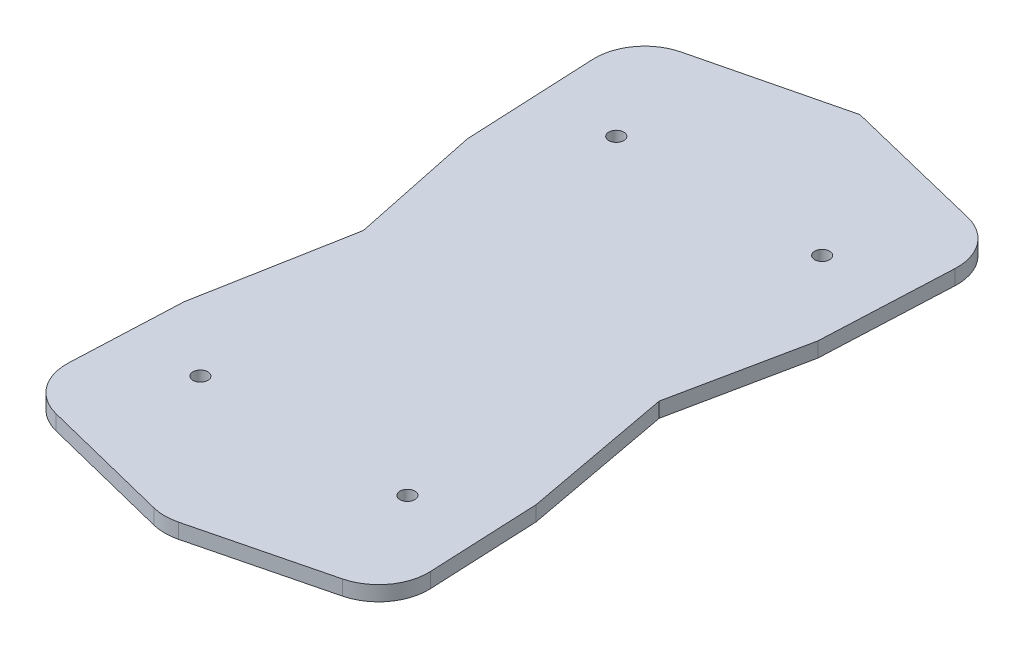
ISO-10303-21;
HEADER;
FILE_DESCRIPTION(('STEP AP214'),'2;1');
FILE_NAME('part.step','',(''),(''),'','','');
FILE_SCHEMA(('AUTOMOTIVE_DESIGN { 1 0 10303 214 1 1 1 1 }'));
ENDSEC;
DATA;
#1=APPLICATION_CONTEXT('core data for automotive mechanical design processes');
#2=APPLICATION_PROTOCOL_DEFINITION('international standard','automotive_design',2000,#1);
#3=PRODUCT_CONTEXT('',#1,'mechanical');
#4=PRODUCT('Part','Part','',(#3));
#5=PRODUCT_RELATED_PRODUCT_CATEGORY('part','',(#4));
#6=PRODUCT_DEFINITION_FORMATION('','',#4);
#7=PRODUCT_DEFINITION_CONTEXT('part definition',#1,'design');
#8=PRODUCT_DEFINITION('design','',#6,#7);
#9=PRODUCT_DEFINITION_SHAPE('','',#8);
#10=(LENGTH_UNIT() NAMED_UNIT(*) SI_UNIT(.MILLI.,.METRE.));
#11=(NAMED_UNIT(*) PLANE_ANGLE_UNIT() SI_UNIT($,.RADIAN.));
#12=(NAMED_UNIT(*) SI_UNIT($,.STERADIAN.) SOLID_ANGLE_UNIT());
#13=UNCERTAINTY_MEASURE_WITH_UNIT(LENGTH_MEASURE(1.E-05),#10,'distance_accuracy_value','');
#14=(GEOMETRIC_REPRESENTATION_CONTEXT(3) GLOBAL_UNCERTAINTY_ASSIGNED_CONTEXT((#13)) GLOBAL_UNIT_ASSIGNED_CONTEXT((#10,
#11,#12)) REPRESENTATION_CONTEXT('',''));
#15=CARTESIAN_POINT('',(0.,0.,0.));
#16=DIRECTION('',(0.,0.,1.));
#17=DIRECTION('',(1.,0.,0.));
#18=AXIS2_PLACEMENT_3D('',#15,#16,#17);
#19=CARTESIAN_POINT('',(-10.3710193297177,3.,41.4840773188708));
#20=DIRECTION('',(-0.242535625036333,0.,0.970142500145332));
#21=DIRECTION('',(0.970142500145332,0.,0.242535625036333));
#22=AXIS2_PLACEMENT_3D('',#19,#20,#21);
#23=PLANE('',#22);
#24=DIRECTION('',(-0.970142500145332,0.,-0.242535625036333));
#25=VECTOR('',#24,1.);
#26=CARTESIAN_POINT('',(-10.3710193297177,0.,41.4840773188708));
#27=LINE('',#26,#25);
#28=CARTESIAN_POINT('',(-2.42535625036336,0.,43.4704930887094));
#29=VERTEX_POINT('',#28);
#30=CARTESIAN_POINT('',(-28.730703821593,0.,36.894156195902));
#31=VERTEX_POINT('',#30);
#32=EDGE_CURVE('E199',#29,#31,#27,.T.);
#33=ORIENTED_EDGE('',*,*,#32,.F.);
#34=DIRECTION('',(0.,-1.,0.));
#35=VECTOR('',#34,1.);
#36=CARTESIAN_POINT('',(-2.42535625036336,3.,43.4704930887094));
#37=LINE('',#36,#35);
#38=CARTESIAN_POINT('',(-2.42535625036336,3.,43.4704930887094));
#39=VERTEX_POINT('',#38);
#40=EDGE_CURVE('E11',#39,#29,#37,.T.);
#41=ORIENTED_EDGE('',*,*,#40,.F.);
#42=DIRECTION('',(-0.970142500145332,0.,-0.242535625036333));
#43=VECTOR('',#42,1.);
#44=CARTESIAN_POINT('',(-10.3710193297177,3.,41.4840773188708));
#45=LINE('',#44,#43);
#46=CARTESIAN_POINT('',(-28.730703821593,3.,36.894156195902));
#47=VERTEX_POINT('',#46);
#48=EDGE_CURVE('E564',#39,#47,#45,.T.);
#49=ORIENTED_EDGE('',*,*,#48,.T.);
#50=DIRECTION('',(0.,-1.,0.));
#51=VECTOR('',#50,1.);
#52=CARTESIAN_POINT('',(-28.730703821593,3.,36.894156195902));
#53=LINE('',#52,#51);
#54=EDGE_CURVE('E56',#47,#31,#53,.T.);
#55=ORIENTED_EDGE('',*,*,#54,.T.);
#56=EDGE_LOOP('',(#33,#41,#49,#55));
#57=FACE_BOUND('',#56,.T.);
#58=ADVANCED_FACE('F39',(#57),#23,.T.);
#59=CARTESIAN_POINT('',(0.,3.,33.7690680872561));
#60=DIRECTION('',(0.,-1.,0.));
#61=DIRECTION('',(0.,0.,-1.));
#62=AXIS2_PLACEMENT_3D('',#59,#60,#61);
#63=CYLINDRICAL_SURFACE('',#62,10.);
#64=CARTESIAN_POINT('',(0.,0.,33.7690680872561));
#65=DIRECTION('',(0.,1.,0.));
#66=DIRECTION('',(0.,0.,1.));
#67=AXIS2_PLACEMENT_3D('',#64,#65,#66);
#68=CIRCLE('',#67,10.);
#69=CARTESIAN_POINT('',(2.42535625036337,0.,43.4704930887094));
#70=VERTEX_POINT('',#69);
#71=EDGE_CURVE('E201',#29,#70,#68,.T.);
#72=ORIENTED_EDGE('',*,*,#71,.T.);
#73=DIRECTION('',(0.,-1.,0.));
#74=VECTOR('',#73,1.);
#75=CARTESIAN_POINT('',(2.42535625036337,3.,43.4704930887094));
#76=LINE('',#75,#74);
#77=CARTESIAN_POINT('',(2.42535625036337,3.,43.4704930887094));
#78=VERTEX_POINT('',#77);
#79=EDGE_CURVE('E48',#78,#70,#76,.T.);
#80=ORIENTED_EDGE('',*,*,#79,.F.);
#81=CARTESIAN_POINT('',(0.,3.,33.7690680872561));
#82=DIRECTION('',(0.,1.,0.));
#83=DIRECTION('',(0.,0.,1.));
#84=AXIS2_PLACEMENT_3D('',#81,#82,#83);
#85=CIRCLE('',#84,10.);
#86=EDGE_CURVE('E525',#39,#78,#85,.T.);
#87=ORIENTED_EDGE('',*,*,#86,.F.);
#88=ORIENTED_EDGE('',*,*,#40,.T.);
#89=EDGE_LOOP('',(#72,#80,#87,#88));
#90=FACE_BOUND('',#89,.T.);
#91=ADVANCED_FACE('F287',(#90),#63,.T.);
#92=CARTESIAN_POINT('',(10.3710193297177,3.,41.4840773188708));
#93=DIRECTION('',(-0.242535625036333,0.,-0.970142500145332));
#94=DIRECTION('',(-0.970142500145332,0.,0.242535625036333));
#95=AXIS2_PLACEMENT_3D('',#92,#93,#94);
#96=PLANE('',#95);
#97=DIRECTION('',(0.970142500145332,0.,-0.242535625036333));
#98=VECTOR('',#97,1.);
#99=CARTESIAN_POINT('',(10.3710193297177,0.,41.4840773188708));
#100=LINE('',#99,#98);
#101=CARTESIAN_POINT('',(28.8037959309387,0.,36.8758831685656));
#102=VERTEX_POINT('',#101);
#103=EDGE_CURVE('E204',#70,#102,#100,.T.);
#104=ORIENTED_EDGE('',*,*,#103,.T.);
#105=DIRECTION('',(0.,-1.,0.));
#106=VECTOR('',#105,1.);
#107=CARTESIAN_POINT('',(28.8037959309387,3.,36.8758831685656));
#108=LINE('',#107,#106);
#109=CARTESIAN_POINT('',(28.8037959309387,3.,36.8758831685656));
#110=VERTEX_POINT('',#109);
#111=EDGE_CURVE('E275',#110,#102,#108,.T.);
#112=ORIENTED_EDGE('',*,*,#111,.F.);
#113=DIRECTION('',(0.970142500145332,0.,-0.242535625036333));
#114=VECTOR('',#113,1.);
#115=CARTESIAN_POINT('',(10.3710193297177,3.,41.4840773188708));
#116=LINE('',#115,#114);
#117=EDGE_CURVE('E283',#78,#110,#116,.T.);
#118=ORIENTED_EDGE('',*,*,#117,.F.);
#119=ORIENTED_EDGE('',*,*,#79,.T.);
#120=EDGE_LOOP('',(#104,#112,#118,#119));
#121=FACE_BOUND('',#120,.T.);
#122=ADVANCED_FACE('F280',(#121),#96,.F.);
#123=CARTESIAN_POINT('',(26.3784396805755,3.,27.1744581671122));
#124=DIRECTION('',(0.,-1.,0.));
#125=DIRECTION('',(0.,0.,-1.));
#126=AXIS2_PLACEMENT_3D('',#123,#124,#125);
#127=CYLINDRICAL_SURFACE('',#126,10.);
#128=CARTESIAN_POINT('',(26.3784396805755,0.,27.1744581671122));
#129=DIRECTION('',(0.,1.,0.));
#130=DIRECTION('',(0.,0.,1.));
#131=AXIS2_PLACEMENT_3D('',#128,#129,#130);
#132=CIRCLE('',#131,10.);
#133=CARTESIAN_POINT('',(36.3680270661534,0.,26.7182303009069));
#134=VERTEX_POINT('',#133);
#135=EDGE_CURVE('E207',#102,#134,#132,.T.);
#136=ORIENTED_EDGE('',*,*,#135,.T.);
#137=DIRECTION('',(0.,-1.,0.));
#138=VECTOR('',#137,1.);
#139=CARTESIAN_POINT('',(36.3680270661534,3.,26.7182303009069));
#140=LINE('',#139,#138);
#141=CARTESIAN_POINT('',(36.3680270661534,3.,26.7182303009069));
#142=VERTEX_POINT('',#141);
#143=EDGE_CURVE('E272',#142,#134,#140,.T.);
#144=ORIENTED_EDGE('',*,*,#143,.F.);
#145=CARTESIAN_POINT('',(26.3784396805755,3.,27.1744581671122));
#146=DIRECTION('',(0.,1.,0.));
#147=DIRECTION('',(0.,0.,1.));
#148=AXIS2_PLACEMENT_3D('',#145,#146,#147);
#149=CIRCLE('',#148,10.);
#150=EDGE_CURVE('E522',#110,#142,#149,.T.);
#151=ORIENTED_EDGE('',*,*,#150,.F.);
#152=ORIENTED_EDGE('',*,*,#111,.T.);
#153=EDGE_LOOP('',(#136,#144,#151,#152));
#154=FACE_BOUND('',#153,.T.);
#155=ADVANCED_FACE('F379',(#154),#127,.T.);
#156=CARTESIAN_POINT('',(35.0746383849418,3.,-1.60187070903288));
#157=DIRECTION('',(-0.998958738557794,0.,0.0456227866205218));
#158=DIRECTION('',(0.0456227866205218,0.,0.998958738557794));
#159=AXIS2_PLACEMENT_3D('',#156,#157,#158);
#160=PLANE('',#159);
#161=DIRECTION('',(-0.0456227866205218,0.,-0.998958738557794));
#162=VECTOR('',#161,1.);
#163=CARTESIAN_POINT('',(35.0746383849418,0.,-1.60187070903288));
#164=LINE('',#163,#162);
#165=CARTESIAN_POINT('',(35.3529653568447,0.,4.49239010566538));
#166=VERTEX_POINT('',#165);
#167=EDGE_CURVE('E210',#134,#166,#164,.T.);
#168=ORIENTED_EDGE('',*,*,#167,.T.);
#169=DIRECTION('',(0.,-1.,0.));
#170=VECTOR('',#169,1.);
#171=CARTESIAN_POINT('',(35.3529653568447,3.,4.49239010566538));
#172=LINE('',#171,#170);
#173=CARTESIAN_POINT('',(35.3529653568447,3.,4.49239010566538));
#174=VERTEX_POINT('',#173);
#175=EDGE_CURVE('E269',#174,#166,#172,.T.);
#176=ORIENTED_EDGE('',*,*,#175,.F.);
#177=DIRECTION('',(-0.0456227866205218,0.,-0.998958738557794));
#178=VECTOR('',#177,1.);
#179=CARTESIAN_POINT('',(35.0746383849418,3.,-1.60187070903288));
#180=LINE('',#179,#178);
#181=EDGE_CURVE('E519',#142,#174,#180,.T.);
#182=ORIENTED_EDGE('',*,*,#181,.F.);
#183=ORIENTED_EDGE('',*,*,#143,.T.);
#184=EDGE_LOOP('',(#168,#176,#182,#183));
#185=FACE_BOUND('',#184,.T.);
#186=ADVANCED_FACE('F375',(#185),#160,.F.);
#187=CARTESIAN_POINT('',(33.3628804391479,3.,-6.20604473246921));
#188=DIRECTION('',(-0.983135362850529,0.,0.182879354528495));
#189=DIRECTION('',(0.182879354528495,0.,0.983135362850529));
#190=AXIS2_PLACEMENT_3D('',#187,#188,#189);
#191=PLANE('',#190);
#192=DIRECTION('',(-0.182879354528495,0.,-0.983135362850529));
#193=VECTOR('',#192,1.);
#194=CARTESIAN_POINT('',(33.3628804391479,0.,-6.20604473246921));
#195=LINE('',#194,#193);
#196=CARTESIAN_POINT('',(29.6982295397226,0.,-25.9067260970551));
#197=VERTEX_POINT('',#196);
#198=EDGE_CURVE('E213',#166,#197,#195,.T.);
#199=ORIENTED_EDGE('',*,*,#198,.T.);
#200=DIRECTION('',(0.,-1.,0.));
#201=VECTOR('',#200,1.);
#202=CARTESIAN_POINT('',(29.6982295397226,3.,-25.9067260970551));
#203=LINE('',#202,#201);
#204=CARTESIAN_POINT('',(29.6982295397226,3.,-25.9067260970551));
#205=VERTEX_POINT('',#204);
#206=EDGE_CURVE('E267',#205,#197,#203,.T.);
#207=ORIENTED_EDGE('',*,*,#206,.F.);
#208=DIRECTION('',(-0.182879354528495,0.,-0.983135362850529));
#209=VECTOR('',#208,1.);
#210=CARTESIAN_POINT('',(33.3628804391479,3.,-6.20604473246921));
#211=LINE('',#210,#209);
#212=EDGE_CURVE('E521',#174,#205,#211,.T.);
#213=ORIENTED_EDGE('',*,*,#212,.F.);
#214=ORIENTED_EDGE('',*,*,#175,.T.);
#215=EDGE_LOOP('',(#199,#207,#213,#214));
#216=FACE_BOUND('',#215,.T.);
#217=ADVANCED_FACE('F371',(#216),#191,.F.);
#218=CARTESIAN_POINT('',(23.3411092015436,3.,4.82785890857507));
#219=DIRECTION('',(0.97927153969698,0.,0.202551849015274));
#220=DIRECTION('',(0.202551849015274,0.,-0.97927153969698));
#221=AXIS2_PLACEMENT_3D('',#218,#219,#220);
#222=PLANE('',#221);
#223=DIRECTION('',(-0.202551849015274,0.,0.97927153969698));
#224=VECTOR('',#223,1.);
#225=CARTESIAN_POINT('',(23.3411092015436,0.,4.82785890857507));
#226=LINE('',#225,#224);
#227=CARTESIAN_POINT('',(35.1590447336644,0.,-52.3079706621877));
#228=VERTEX_POINT('',#227);
#229=EDGE_CURVE('E216',#228,#197,#226,.T.);
#230=ORIENTED_EDGE('',*,*,#229,.F.);
#231=DIRECTION('',(0.,-1.,0.));
#232=VECTOR('',#231,1.);
#233=CARTESIAN_POINT('',(35.1590447336644,3.,-52.3079706621877));
#234=LINE('',#233,#232);
#235=CARTESIAN_POINT('',(35.1590447336644,3.,-52.3079706621877));
#236=VERTEX_POINT('',#235);
#237=EDGE_CURVE('E265',#236,#228,#234,.T.);
#238=ORIENTED_EDGE('',*,*,#237,.F.);
#239=DIRECTION('',(-0.202551849015274,0.,0.97927153969698));
#240=VECTOR('',#239,1.);
#241=CARTESIAN_POINT('',(23.3411092015436,3.,4.82785890857507));
#242=LINE('',#241,#240);
#243=EDGE_CURVE('E530',#236,#205,#242,.T.);
#244=ORIENTED_EDGE('',*,*,#243,.T.);
#245=ORIENTED_EDGE('',*,*,#206,.T.);
#246=EDGE_LOOP('',(#230,#238,#244,#245));
#247=FACE_BOUND('',#246,.T.);
#248=ADVANCED_FACE('F367',(#247),#222,.T.);
#249=CARTESIAN_POINT('',(32.7256015210382,3.,1.48053730997149));
#250=DIRECTION('',(0.998978196470814,0.,0.0451947228768965));
#251=DIRECTION('',(0.0451947228768965,0.,-0.998978196470814));
#252=AXIS2_PLACEMENT_3D('',#249,#250,#251);
#253=PLANE('',#252);
#254=DIRECTION('',(-0.0451947228768966,0.,0.998978196470814));
#255=VECTOR('',#254,1.);
#256=CARTESIAN_POINT('',(32.7256015210382,0.,1.48053730997149));
#257=LINE('',#256,#255);
#258=CARTESIAN_POINT('',(36.3534621252968,0.,-78.7092152273204));
#259=VERTEX_POINT('',#258);
#260=EDGE_CURVE('E219',#259,#228,#257,.T.);
#261=ORIENTED_EDGE('',*,*,#260,.F.);
#262=DIRECTION('',(0.,-1.,0.));
#263=VECTOR('',#262,1.);
#264=CARTESIAN_POINT('',(36.3534621252968,3.,-78.7092152273204));
#265=LINE('',#264,#263);
#266=CARTESIAN_POINT('',(36.3534621252968,3.,-78.7092152273204));
#267=VERTEX_POINT('',#266);
#268=EDGE_CURVE('E263',#267,#259,#265,.T.);
#269=ORIENTED_EDGE('',*,*,#268,.F.);
#270=DIRECTION('',(-0.0451947228768966,0.,0.998978196470814));
#271=VECTOR('',#270,1.);
#272=CARTESIAN_POINT('',(32.7256015210382,3.,1.48053730997149));
#273=LINE('',#272,#271);
#274=EDGE_CURVE('E533',#267,#236,#273,.T.);
#275=ORIENTED_EDGE('',*,*,#274,.T.);
#276=ORIENTED_EDGE('',*,*,#237,.T.);
#277=EDGE_LOOP('',(#261,#269,#275,#276));
#278=FACE_BOUND('',#277,.T.);
#279=ADVANCED_FACE('F363',(#278),#253,.T.);
#280=CARTESIAN_POINT('',(26.3636801605887,3.,-79.1611624560894));
#281=DIRECTION('',(0.,-1.,0.));
#282=DIRECTION('',(0.,0.,-1.));
#283=AXIS2_PLACEMENT_3D('',#280,#281,#282);
#284=CYLINDRICAL_SURFACE('',#283,10.);
#285=CARTESIAN_POINT('',(26.3636801605887,0.,-79.1611624560894));
#286=DIRECTION('',(0.,1.,0.));
#287=DIRECTION('',(0.,0.,1.));
#288=AXIS2_PLACEMENT_3D('',#285,#286,#287);
#289=CIRCLE('',#288,10.);
#290=CARTESIAN_POINT('',(28.7455821439129,0.,-88.8733477375714));
#291=VERTEX_POINT('',#290);
#292=EDGE_CURVE('E222',#291,#259,#289,.F.);
#293=ORIENTED_EDGE('',*,*,#292,.F.);
#294=DIRECTION('',(0.,-1.,0.));
#295=VECTOR('',#294,1.);
#296=CARTESIAN_POINT('',(28.7455821439129,3.,-88.8733477375714));
#297=LINE('',#296,#295);
#298=CARTESIAN_POINT('',(28.7455821439129,3.,-88.8733477375714));
#299=VERTEX_POINT('',#298);
#300=EDGE_CURVE('E261',#299,#291,#297,.T.);
#301=ORIENTED_EDGE('',*,*,#300,.F.);
#302=CARTESIAN_POINT('',(26.3636801605887,3.,-79.1611624560894));
#303=DIRECTION('',(0.,1.,0.));
#304=DIRECTION('',(0.,0.,1.));
#305=AXIS2_PLACEMENT_3D('',#302,#303,#304);
#306=CIRCLE('',#305,10.);
#307=EDGE_CURVE('E536',#299,#267,#306,.F.);
#308=ORIENTED_EDGE('',*,*,#307,.T.);
#309=ORIENTED_EDGE('',*,*,#268,.T.);
#310=EDGE_LOOP('',(#293,#301,#308,#309));
#311=FACE_BOUND('',#310,.T.);
#312=ADVANCED_FACE('F359',(#311),#284,.T.);
#313=CARTESIAN_POINT('',(22.190360503728,3.,-90.4810081119732));
#314=DIRECTION('',(0.238190198332426,0.,-0.971218528148202));
#315=DIRECTION('',(-0.971218528148202,0.,-0.238190198332426));
#316=AXIS2_PLACEMENT_3D('',#313,#314,#315);
#317=PLANE('',#316);
#318=DIRECTION('',(0.971218528148202,0.,0.238190198332426));
#319=VECTOR('',#318,1.);
#320=CARTESIAN_POINT('',(22.190360503728,0.,-90.4810081119732));
#321=LINE('',#320,#319);
#322=CARTESIAN_POINT('',(0.,0.,-95.9231678486998));
#323=VERTEX_POINT('',#322);
#324=EDGE_CURVE('E225',#323,#291,#321,.T.);
#325=ORIENTED_EDGE('',*,*,#324,.F.);
#326=DIRECTION('',(0.,-1.,0.));
#327=VECTOR('',#326,1.);
#328=CARTESIAN_POINT('',(0.,3.,-95.9231678486998));
#329=LINE('',#328,#327);
#330=CARTESIAN_POINT('',(0.,3.,-95.9231678486998));
#331=VERTEX_POINT('',#330);
#332=EDGE_CURVE('E259',#331,#323,#329,.T.);
#333=ORIENTED_EDGE('',*,*,#332,.F.);
#334=DIRECTION('',(0.971218528148202,0.,0.238190198332426));
#335=VECTOR('',#334,1.);
#336=CARTESIAN_POINT('',(22.190360503728,3.,-90.4810081119732));
#337=LINE('',#336,#335);
#338=EDGE_CURVE('E539',#331,#299,#337,.T.);
#339=ORIENTED_EDGE('',*,*,#338,.T.);
#340=ORIENTED_EDGE('',*,*,#300,.T.);
#341=EDGE_LOOP('',(#325,#333,#339,#340));
#342=FACE_BOUND('',#341,.T.);
#343=ADVANCED_FACE('F355',(#342),#317,.T.);
#344=CARTESIAN_POINT('',(-22.1648936329896,3.,-90.4942892553151));
#345=DIRECTION('',(0.23789937899726,0.,0.971289805090488));
#346=DIRECTION('',(0.971289805090488,0.,-0.23789937899726));
#347=AXIS2_PLACEMENT_3D('',#344,#345,#346);
#348=PLANE('',#347);
#349=DIRECTION('',(-0.971289805090488,0.,0.23789937899726));
#350=VECTOR('',#349,1.);
#351=CARTESIAN_POINT('',(-22.1648936329896,0.,-90.4942892553151));
#352=LINE('',#351,#350);
#353=CARTESIAN_POINT('',(-28.8409892724337,0.,-88.8591037541123));
#354=VERTEX_POINT('',#353);
#355=EDGE_CURVE('E228',#323,#354,#352,.T.);
#356=ORIENTED_EDGE('',*,*,#355,.T.);
#357=DIRECTION('',(0.,-1.,0.));
#358=VECTOR('',#357,1.);
#359=CARTESIAN_POINT('',(-28.8409892724337,3.,-88.8591037541123));
#360=LINE('',#359,#358);
#361=CARTESIAN_POINT('',(-28.8409892724337,3.,-88.8591037541123));
#362=VERTEX_POINT('',#361);
#363=EDGE_CURVE('E256',#362,#354,#360,.T.);
#364=ORIENTED_EDGE('',*,*,#363,.F.);
#365=DIRECTION('',(-0.971289805090488,0.,0.23789937899726));
#366=VECTOR('',#365,1.);
#367=CARTESIAN_POINT('',(-22.1648936329896,3.,-90.4942892553151));
#368=LINE('',#367,#366);
#369=EDGE_CURVE('E542',#331,#362,#368,.T.);
#370=ORIENTED_EDGE('',*,*,#369,.F.);
#371=ORIENTED_EDGE('',*,*,#332,.T.);
#372=EDGE_LOOP('',(#356,#364,#370,#371));
#373=FACE_BOUND('',#372,.T.);
#374=ADVANCED_FACE('F351',(#373),#348,.F.);
#375=CARTESIAN_POINT('',(-26.4619954824612,3.,-79.1462057032074));
#376=DIRECTION('',(0.,-1.,0.));
#377=DIRECTION('',(0.,0.,-1.));
#378=AXIS2_PLACEMENT_3D('',#375,#376,#377);
#379=CYLINDRICAL_SURFACE('',#378,10.);
#380=CARTESIAN_POINT('',(-26.4619954824612,0.,-79.1462057032074));
#381=DIRECTION('',(0.,1.,0.));
#382=DIRECTION('',(0.,0.,1.));
#383=AXIS2_PLACEMENT_3D('',#380,#381,#382);
#384=CIRCLE('',#383,10.);
#385=CARTESIAN_POINT('',(-36.4511766301933,0.,-78.6811680726947));
#386=VERTEX_POINT('',#385);
#387=EDGE_CURVE('E231',#354,#386,#384,.T.);
#388=ORIENTED_EDGE('',*,*,#387,.T.);
#389=DIRECTION('',(0.,-1.,0.));
#390=VECTOR('',#389,1.);
#391=CARTESIAN_POINT('',(-36.4511766301933,3.,-78.6811680726947));
#392=LINE('',#391,#390);
#393=CARTESIAN_POINT('',(-36.4511766301933,3.,-78.6811680726947));
#394=VERTEX_POINT('',#393);
#395=EDGE_CURVE('E253',#394,#386,#392,.T.);
#396=ORIENTED_EDGE('',*,*,#395,.F.);
#397=CARTESIAN_POINT('',(-26.4619954824612,3.,-79.1462057032074));
#398=DIRECTION('',(0.,1.,0.));
#399=DIRECTION('',(0.,0.,1.));
#400=AXIS2_PLACEMENT_3D('',#397,#398,#399);
#401=CIRCLE('',#400,10.);
#402=EDGE_CURVE('E545',#362,#394,#401,.T.);
#403=ORIENTED_EDGE('',*,*,#402,.F.);
#404=ORIENTED_EDGE('',*,*,#363,.T.);
#405=EDGE_LOOP('',(#388,#396,#403,#404));
#406=FACE_BOUND('',#405,.T.);
#407=ADVANCED_FACE('F347',(#406),#379,.T.);
#408=CARTESIAN_POINT('',(-32.7173355057862,3.,1.52312706670152));
#409=DIRECTION('',(0.998918114773214,0.,-0.0465037630512563));
#410=DIRECTION('',(-0.0465037630512563,0.,-0.998918114773214));
#411=AXIS2_PLACEMENT_3D('',#408,#409,#410);
#412=PLANE('',#411);
#413=DIRECTION('',(0.0465037630512563,0.,0.998918114773214));
#414=VECTOR('',#413,1.);
#415=CARTESIAN_POINT('',(-32.7173355057862,0.,1.52312706670152));
#416=LINE('',#415,#414);
#417=CARTESIAN_POINT('',(-35.2217954691318,0.,-52.2736037989882));
#418=VERTEX_POINT('',#417);
#419=EDGE_CURVE('E234',#386,#418,#416,.T.);
#420=ORIENTED_EDGE('',*,*,#419,.T.);
#421=DIRECTION('',(0.,-1.,0.));
#422=VECTOR('',#421,1.);
#423=CARTESIAN_POINT('',(-35.2217954691318,3.,-52.2736037989882));
#424=LINE('',#423,#422);
#425=CARTESIAN_POINT('',(-35.2217954691318,3.,-52.2736037989882));
#426=VERTEX_POINT('',#425);
#427=EDGE_CURVE('E250',#426,#418,#424,.T.);
#428=ORIENTED_EDGE('',*,*,#427,.F.);
#429=DIRECTION('',(0.0465037630512563,0.,0.998918114773214));
#430=VECTOR('',#429,1.);
#431=CARTESIAN_POINT('',(-32.7173355057862,3.,1.52312706670152));
#432=LINE('',#431,#430);
#433=EDGE_CURVE('E548',#394,#426,#432,.T.);
#434=ORIENTED_EDGE('',*,*,#433,.F.);
#435=ORIENTED_EDGE('',*,*,#395,.T.);
#436=EDGE_LOOP('',(#420,#428,#434,#435));
#437=FACE_BOUND('',#436,.T.);
#438=ADVANCED_FACE('F343',(#437),#412,.F.);
#439=CARTESIAN_POINT('',(-23.3048911482188,3.,4.86085239169404));
#440=DIRECTION('',(0.978932865591026,0.,-0.20418238088959));
#441=DIRECTION('',(-0.20418238088959,0.,-0.978932865591026));
#442=AXIS2_PLACEMENT_3D('',#439,#440,#441);
#443=PLANE('',#442);
#444=DIRECTION('',(0.20418238088959,0.,0.978932865591026));
#445=VECTOR('',#444,1.);
#446=CARTESIAN_POINT('',(-23.3048911482188,0.,4.86085239169404));
#447=LINE('',#446,#445);
#448=CARTESIAN_POINT('',(-29.7137984078166,0.,-25.8660395252816));
#449=VERTEX_POINT('',#448);
#450=EDGE_CURVE('E237',#418,#449,#447,.T.);
#451=ORIENTED_EDGE('',*,*,#450,.T.);
#452=DIRECTION('',(0.,-1.,0.));
#453=VECTOR('',#452,1.);
#454=CARTESIAN_POINT('',(-29.7137984078166,3.,-25.8660395252816));
#455=LINE('',#454,#453);
#456=CARTESIAN_POINT('',(-29.7137984078166,3.,-25.8660395252816));
#457=VERTEX_POINT('',#456);
#458=EDGE_CURVE('E169',#457,#449,#455,.T.);
#459=ORIENTED_EDGE('',*,*,#458,.F.);
#460=DIRECTION('',(0.20418238088959,0.,0.978932865591026));
#461=VECTOR('',#460,1.);
#462=CARTESIAN_POINT('',(-23.3048911482188,3.,4.86085239169404));
#463=LINE('',#462,#461);
#464=EDGE_CURVE('E178',#426,#457,#463,.T.);
#465=ORIENTED_EDGE('',*,*,#464,.F.);
#466=ORIENTED_EDGE('',*,*,#427,.T.);
#467=EDGE_LOOP('',(#451,#459,#465,#466));
#468=FACE_BOUND('',#467,.T.);
#469=ADVANCED_FACE('F340',(#468),#443,.F.);
#470=CARTESIAN_POINT('',(-33.3516445590481,3.,-6.15549452222428));
#471=DIRECTION('',(-0.983391297388068,0.,-0.181498088754159));
#472=DIRECTION('',(-0.181498088754159,0.,0.983391297388068));
#473=AXIS2_PLACEMENT_3D('',#470,#471,#472);
#474=PLANE('',#473);
#475=DIRECTION('',(0.181498088754159,0.,-0.983391297388068));
#476=VECTOR('',#475,1.);
#477=CARTESIAN_POINT('',(-33.3516445590481,0.,-6.15549452222428));
#478=LINE('',#477,#476);
#479=CARTESIAN_POINT('',(-35.3226493526154,0.,4.52378576336424));
#480=VERTEX_POINT('',#479);
#481=EDGE_CURVE('E165',#480,#449,#478,.T.);
#482=ORIENTED_EDGE('',*,*,#481,.F.);
#483=DIRECTION('',(0.,-1.,0.));
#484=VECTOR('',#483,1.);
#485=CARTESIAN_POINT('',(-35.3226493526154,3.,4.52378576336424));
#486=LINE('',#485,#484);
#487=CARTESIAN_POINT('',(-35.3226493526154,3.,4.52378576336424));
#488=VERTEX_POINT('',#487);
#489=EDGE_CURVE('E160',#488,#480,#486,.T.);
#490=ORIENTED_EDGE('',*,*,#489,.F.);
#491=DIRECTION('',(0.181498088754159,0.,-0.983391297388068));
#492=VECTOR('',#491,1.);
#493=CARTESIAN_POINT('',(-33.3516445590481,3.,-6.15549452222428));
#494=LINE('',#493,#492);
#495=EDGE_CURVE('E163',#488,#457,#494,.T.);
#496=ORIENTED_EDGE('',*,*,#495,.T.);
#497=ORIENTED_EDGE('',*,*,#458,.T.);
#498=EDGE_LOOP('',(#482,#490,#496,#497));
#499=FACE_BOUND('',#498,.T.);
#500=ADVANCED_FACE('F162',(#499),#474,.T.);
#501=CARTESIAN_POINT('',(-35.057461625707,3.,-1.53454860580377));
#502=DIRECTION('',(-0.999043363764924,0.,-0.0437305078551037));
#503=DIRECTION('',(-0.0437305078551037,0.,0.999043363764924));
#504=AXIS2_PLACEMENT_3D('',#501,#502,#503);
#505=PLANE('',#504);
#506=DIRECTION('',(0.0437305078551037,0.,-0.999043363764924));
#507=VECTOR('',#506,1.);
#508=CARTESIAN_POINT('',(-35.057461625707,0.,-1.53454860580377));
#509=LINE('',#508,#507);
#510=CARTESIAN_POINT('',(-36.2957812088789,0.,26.7554261158976));
#511=VERTEX_POINT('',#510);
#512=EDGE_CURVE('E241',#511,#480,#509,.T.);
#513=ORIENTED_EDGE('',*,*,#512,.F.);
#514=DIRECTION('',(0.,-1.,0.));
#515=VECTOR('',#514,1.);
#516=CARTESIAN_POINT('',(-36.2957812088789,3.,26.7554261158976));
#517=LINE('',#516,#515);
#518=CARTESIAN_POINT('',(-36.2957812088789,3.,26.7554261158976));
#519=VERTEX_POINT('',#518);
#520=EDGE_CURVE('E108',#519,#511,#517,.T.);
#521=ORIENTED_EDGE('',*,*,#520,.F.);
#522=DIRECTION('',(0.0437305078551037,0.,-0.999043363764924));
#523=VECTOR('',#522,1.);
#524=CARTESIAN_POINT('',(-35.057461625707,3.,-1.53454860580377));
#525=LINE('',#524,#523);
#526=EDGE_CURVE('E176',#519,#488,#525,.T.);
#527=ORIENTED_EDGE('',*,*,#526,.T.);
#528=ORIENTED_EDGE('',*,*,#489,.T.);
#529=EDGE_LOOP('',(#513,#521,#527,#528));
#530=FACE_BOUND('',#529,.T.);
#531=ADVANCED_FACE('F181',(#530),#505,.T.);
#532=CARTESIAN_POINT('',(20.8099349337232,3.,15.8063574264627));
#533=DIRECTION('',(0.,-1.,0.));
#534=DIRECTION('',(0.,0.,-1.));
#535=AXIS2_PLACEMENT_3D('',#532,#533,#534);
#536=CYLINDRICAL_SURFACE('',#535,1.5);
#537=CARTESIAN_POINT('',(20.8099349337232,3.,15.8063574264627));
#538=DIRECTION('',(0.,1.,0.));
#539=DIRECTION('',(0.,0.,1.));
#540=AXIS2_PLACEMENT_3D('',#537,#538,#539);
#541=CIRCLE('',#540,1.5);
#542=CARTESIAN_POINT('',(20.8099349337232,3.,17.3063574264627));
#543=VERTEX_POINT('',#542);
#544=EDGE_CURVE('E566',#543,#543,#541,.T.);
#545=ORIENTED_EDGE('',*,*,#544,.T.);
#546=EDGE_LOOP('',(#545));
#547=FACE_BOUND('',#546,.T.);
#548=CARTESIAN_POINT('',(20.8099349337232,0.,15.8063574264627));
#549=DIRECTION('',(0.,1.,0.));
#550=DIRECTION('',(0.,0.,1.));
#551=AXIS2_PLACEMENT_3D('',#548,#549,#550);
#552=CIRCLE('',#551,1.5);
#553=CARTESIAN_POINT('',(20.8099349337232,0.,17.3063574264627));
#554=VERTEX_POINT('',#553);
#555=EDGE_CURVE('E196',#554,#554,#552,.T.);
#556=ORIENTED_EDGE('',*,*,#555,.F.);
#557=EDGE_LOOP('',(#556));
#558=FACE_BOUND('',#557,.T.);
#559=ADVANCED_FACE('F298',(#547,#558),#536,.F.);
#560=CARTESIAN_POINT('',(-20.7507098453628,3.,15.8486152765747));
#561=DIRECTION('',(0.,-1.,0.));
#562=DIRECTION('',(0.,0.,-1.));
#563=AXIS2_PLACEMENT_3D('',#560,#561,#562);
#564=CYLINDRICAL_SURFACE('',#563,1.5);
#565=CARTESIAN_POINT('',(-20.7507098453628,3.,15.8486152765747));
#566=DIRECTION('',(0.,1.,0.));
#567=DIRECTION('',(0.,0.,1.));
#568=AXIS2_PLACEMENT_3D('',#565,#566,#567);
#569=CIRCLE('',#568,1.5);
#570=CARTESIAN_POINT('',(-20.7507098453628,3.,17.3486152765747));
#571=VERTEX_POINT('',#570);
#572=EDGE_CURVE('E569',#571,#571,#569,.T.);
#573=ORIENTED_EDGE('',*,*,#572,.T.);
#574=EDGE_LOOP('',(#573));
#575=FACE_BOUND('',#574,.T.);
#576=CARTESIAN_POINT('',(-20.7507098453628,0.,15.8486152765747));
#577=DIRECTION('',(0.,1.,0.));
#578=DIRECTION('',(0.,0.,1.));
#579=AXIS2_PLACEMENT_3D('',#576,#577,#578);
#580=CIRCLE('',#579,1.5);
#581=CARTESIAN_POINT('',(-20.7507098453628,0.,17.3486152765747));
#582=VERTEX_POINT('',#581);
#583=EDGE_CURVE('E193',#582,#582,#580,.T.);
#584=ORIENTED_EDGE('',*,*,#583,.F.);
#585=EDGE_LOOP('',(#584));
#586=FACE_BOUND('',#585,.T.);
#587=ADVANCED_FACE('F301',(#575,#586),#564,.F.);
#588=CARTESIAN_POINT('',(20.7300300149609,3.,-67.6122372942789));
#589=DIRECTION('',(0.,-1.,0.));
#590=DIRECTION('',(0.,0.,-1.));
#591=AXIS2_PLACEMENT_3D('',#588,#589,#590);
#592=CYLINDRICAL_SURFACE('',#591,1.5);
#593=CARTESIAN_POINT('',(20.7300300149609,3.,-67.6122372942789));
#594=DIRECTION('',(0.,1.,0.));
#595=DIRECTION('',(0.,0.,1.));
#596=AXIS2_PLACEMENT_3D('',#593,#594,#595);
#597=CIRCLE('',#596,1.5);
#598=CARTESIAN_POINT('',(20.7300300149609,3.,-66.1122372942789));
#599=VERTEX_POINT('',#598);
#600=EDGE_CURVE('E316',#599,#599,#597,.T.);
#601=ORIENTED_EDGE('',*,*,#600,.T.);
#602=EDGE_LOOP('',(#601));
#603=FACE_BOUND('',#602,.T.);
#604=CARTESIAN_POINT('',(20.7300300149609,0.,-67.6122372942789));
#605=DIRECTION('',(0.,1.,0.));
#606=DIRECTION('',(0.,0.,1.));
#607=AXIS2_PLACEMENT_3D('',#604,#605,#606);
#608=CIRCLE('',#607,1.5);
#609=CARTESIAN_POINT('',(20.7300300149609,0.,-66.1122372942789));
#610=VERTEX_POINT('',#609);
#611=EDGE_CURVE('E190',#610,#610,#608,.T.);
#612=ORIENTED_EDGE('',*,*,#611,.F.);
#613=EDGE_LOOP('',(#612));
#614=FACE_BOUND('',#613,.T.);
#615=ADVANCED_FACE('F304',(#603,#614),#592,.F.);
#616=CARTESIAN_POINT('',(-20.6926596672451,3.,-67.6601434151025));
#617=DIRECTION('',(0.,-1.,0.));
#618=DIRECTION('',(0.,0.,-1.));
#619=AXIS2_PLACEMENT_3D('',#616,#617,#618);
#620=CYLINDRICAL_SURFACE('',#619,1.5);
#621=CARTESIAN_POINT('',(-20.6926596672451,3.,-67.6601434151025));
#622=DIRECTION('',(0.,1.,0.));
#623=DIRECTION('',(0.,0.,1.));
#624=AXIS2_PLACEMENT_3D('',#621,#622,#623);
#625=CIRCLE('',#624,1.5);
#626=CARTESIAN_POINT('',(-20.6926596672451,3.,-66.1601434151025));
#627=VERTEX_POINT('',#626);
#628=EDGE_CURVE('E246',#627,#627,#625,.T.);
#629=ORIENTED_EDGE('',*,*,#628,.T.);
#630=EDGE_LOOP('',(#629));
#631=FACE_BOUND('',#630,.T.);
#632=CARTESIAN_POINT('',(-20.6926596672451,0.,-67.6601434151025));
#633=DIRECTION('',(0.,1.,0.));
#634=DIRECTION('',(0.,0.,1.));
#635=AXIS2_PLACEMENT_3D('',#632,#633,#634);
#636=CIRCLE('',#635,1.5);
#637=CARTESIAN_POINT('',(-20.6926596672451,0.,-66.1601434151025));
#638=VERTEX_POINT('',#637);
#639=EDGE_CURVE('E187',#638,#638,#636,.T.);
#640=ORIENTED_EDGE('',*,*,#639,.F.);
#641=EDGE_LOOP('',(#640));
#642=FACE_BOUND('',#641,.T.);
#643=ADVANCED_FACE('F41',(#631,#642),#620,.F.);
#644=CARTESIAN_POINT('',(-26.3053475712297,3.,27.1927311944487));
#645=DIRECTION('',(0.,-1.,0.));
#646=DIRECTION('',(0.,0.,-1.));
#647=AXIS2_PLACEMENT_3D('',#644,#645,#646);
#648=CYLINDRICAL_SURFACE('',#647,10.);
#649=CARTESIAN_POINT('',(-26.3053475712297,0.,27.1927311944487));
#650=DIRECTION('',(0.,1.,0.));
#651=DIRECTION('',(0.,0.,1.));
#652=AXIS2_PLACEMENT_3D('',#649,#650,#651);
#653=CIRCLE('',#652,10.);
#654=EDGE_CURVE('E243',#31,#511,#653,.F.);
#655=ORIENTED_EDGE('',*,*,#654,.F.);
#656=ORIENTED_EDGE('',*,*,#54,.F.);
#657=CARTESIAN_POINT('',(-26.3053475712297,3.,27.1927311944487));
#658=DIRECTION('',(0.,1.,0.));
#659=DIRECTION('',(0.,0.,1.));
#660=AXIS2_PLACEMENT_3D('',#657,#658,#659);
#661=CIRCLE('',#660,10.);
#662=EDGE_CURVE('E182',#47,#519,#661,.F.);
#663=ORIENTED_EDGE('',*,*,#662,.T.);
#664=ORIENTED_EDGE('',*,*,#520,.T.);
#665=EDGE_LOOP('',(#655,#656,#663,#664));
#666=FACE_BOUND('',#665,.T.);
#667=ADVANCED_FACE('F311',(#666),#648,.T.);
#668=CARTESIAN_POINT('',(0.,3.,0.));
#669=DIRECTION('',(0.,1.,0.));
#670=DIRECTION('',(0.,0.,1.));
#671=AXIS2_PLACEMENT_3D('',#668,#669,#670);
#672=PLANE('',#671);
#673=ORIENTED_EDGE('',*,*,#628,.F.);
#674=EDGE_LOOP('',(#673));
#675=FACE_BOUND('',#674,.T.);
#676=ORIENTED_EDGE('',*,*,#600,.F.);
#677=EDGE_LOOP('',(#676));
#678=FACE_BOUND('',#677,.T.);
#679=ORIENTED_EDGE('',*,*,#572,.F.);
#680=EDGE_LOOP('',(#679));
#681=FACE_BOUND('',#680,.T.);
#682=ORIENTED_EDGE('',*,*,#544,.F.);
#683=EDGE_LOOP('',(#682));
#684=FACE_BOUND('',#683,.T.);
#685=ORIENTED_EDGE('',*,*,#48,.F.);
#686=ORIENTED_EDGE('',*,*,#86,.T.);
#687=ORIENTED_EDGE('',*,*,#117,.T.);
#688=ORIENTED_EDGE('',*,*,#150,.T.);
#689=ORIENTED_EDGE('',*,*,#181,.T.);
#690=ORIENTED_EDGE('',*,*,#212,.T.);
#691=ORIENTED_EDGE('',*,*,#243,.F.);
#692=ORIENTED_EDGE('',*,*,#274,.F.);
#693=ORIENTED_EDGE('',*,*,#307,.F.);
#694=ORIENTED_EDGE('',*,*,#338,.F.);
#695=ORIENTED_EDGE('',*,*,#369,.T.);
#696=ORIENTED_EDGE('',*,*,#402,.T.);
#697=ORIENTED_EDGE('',*,*,#433,.T.);
#698=ORIENTED_EDGE('',*,*,#464,.T.);
#699=ORIENTED_EDGE('',*,*,#495,.F.);
#700=ORIENTED_EDGE('',*,*,#526,.F.);
#701=ORIENTED_EDGE('',*,*,#662,.F.);
#702=EDGE_LOOP('',(#685,#686,#687,#688,#689,#690,#691,#692,#693,#694,#695,#696,#697,#698,#699,
#700,#701));
#703=FACE_BOUND('',#702,.T.);
#704=ADVANCED_FACE('F174',(#675,#678,#681,#684,#703),#672,.T.);
#705=CARTESIAN_POINT('',(0.,0.,0.));
#706=DIRECTION('',(0.,1.,0.));
#707=DIRECTION('',(0.,0.,1.));
#708=AXIS2_PLACEMENT_3D('',#705,#706,#707);
#709=PLANE('',#708);
#710=ORIENTED_EDGE('',*,*,#639,.T.);
#711=EDGE_LOOP('',(#710));
#712=FACE_BOUND('',#711,.T.);
#713=ORIENTED_EDGE('',*,*,#611,.T.);
#714=EDGE_LOOP('',(#713));
#715=FACE_BOUND('',#714,.T.);
#716=ORIENTED_EDGE('',*,*,#583,.T.);
#717=EDGE_LOOP('',(#716));
#718=FACE_BOUND('',#717,.T.);
#719=ORIENTED_EDGE('',*,*,#555,.T.);
#720=EDGE_LOOP('',(#719));
#721=FACE_BOUND('',#720,.T.);
#722=ORIENTED_EDGE('',*,*,#32,.T.);
#723=ORIENTED_EDGE('',*,*,#654,.T.);
#724=ORIENTED_EDGE('',*,*,#512,.T.);
#725=ORIENTED_EDGE('',*,*,#481,.T.);
#726=ORIENTED_EDGE('',*,*,#450,.F.);
#727=ORIENTED_EDGE('',*,*,#419,.F.);
#728=ORIENTED_EDGE('',*,*,#387,.F.);
#729=ORIENTED_EDGE('',*,*,#355,.F.);
#730=ORIENTED_EDGE('',*,*,#324,.T.);
#731=ORIENTED_EDGE('',*,*,#292,.T.);
#732=ORIENTED_EDGE('',*,*,#260,.T.);
#733=ORIENTED_EDGE('',*,*,#229,.T.);
#734=ORIENTED_EDGE('',*,*,#198,.F.);
#735=ORIENTED_EDGE('',*,*,#167,.F.);
#736=ORIENTED_EDGE('',*,*,#135,.F.);
#737=ORIENTED_EDGE('',*,*,#103,.F.);
#738=ORIENTED_EDGE('',*,*,#71,.F.);
#739=EDGE_LOOP('',(#722,#723,#724,#725,#726,#727,#728,#729,#730,#731,#732,#733,#734,#735,#736,
#737,#738));
#740=FACE_BOUND('',#739,.T.);
#741=ADVANCED_FACE('F289',(#712,#715,#718,#721,#740),#709,.F.);
#742=CLOSED_SHELL('',(#58,#91,#122,#155,#186,#217,#248,#279,#312,#343,#374,#407,#438,#469,#500,
#531,#559,#587,#615,#643,#667,#704,#741));
#743=MANIFOLD_SOLID_BREP('B2',#742);
#744=ADVANCED_BREP_SHAPE_REPRESENTATION('',(#18,#743),#14);
#745=SHAPE_DEFINITION_REPRESENTATION(#9,#744);
ENDSEC;
END-ISO-10303-21;
